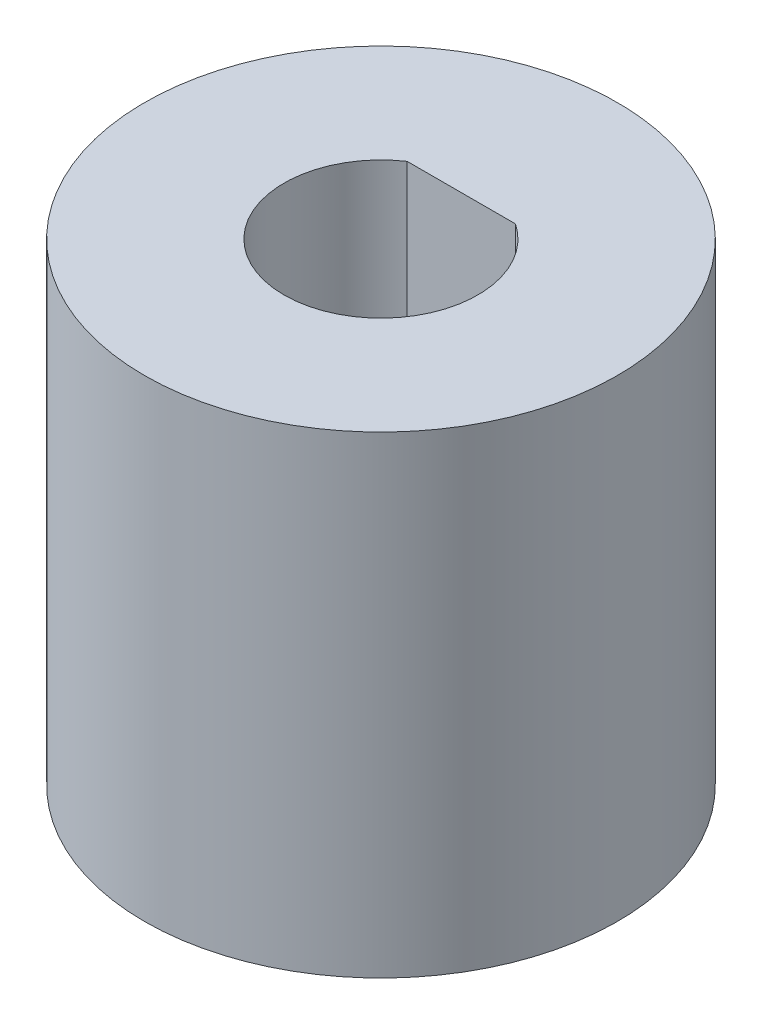
ISO-10303-21;
HEADER;
FILE_DESCRIPTION(('STEP AP214'),'2;1');
FILE_NAME('part.step','',(''),(''),'','','');
FILE_SCHEMA(('AUTOMOTIVE_DESIGN { 1 0 10303 214 1 1 1 1 }'));
ENDSEC;
DATA;
#1=APPLICATION_CONTEXT('core data for automotive mechanical design processes');
#2=APPLICATION_PROTOCOL_DEFINITION('international standard','automotive_design',2000,#1);
#3=PRODUCT_CONTEXT('',#1,'mechanical');
#4=PRODUCT('Part','Part','',(#3));
#5=PRODUCT_RELATED_PRODUCT_CATEGORY('part','',(#4));
#6=PRODUCT_DEFINITION_FORMATION('','',#4);
#7=PRODUCT_DEFINITION_CONTEXT('part definition',#1,'design');
#8=PRODUCT_DEFINITION('design','',#6,#7);
#9=PRODUCT_DEFINITION_SHAPE('','',#8);
#10=(LENGTH_UNIT() NAMED_UNIT(*) SI_UNIT(.MILLI.,.METRE.));
#11=(NAMED_UNIT(*) PLANE_ANGLE_UNIT() SI_UNIT($,.RADIAN.));
#12=(NAMED_UNIT(*) SI_UNIT($,.STERADIAN.) SOLID_ANGLE_UNIT());
#13=UNCERTAINTY_MEASURE_WITH_UNIT(LENGTH_MEASURE(1.E-05),#10,'distance_accuracy_value','');
#14=(GEOMETRIC_REPRESENTATION_CONTEXT(3) GLOBAL_UNCERTAINTY_ASSIGNED_CONTEXT((#13)) GLOBAL_UNIT_ASSIGNED_CONTEXT((#10,
#11,#12)) REPRESENTATION_CONTEXT('',''));
#15=CARTESIAN_POINT('',(0.,0.,0.));
#16=DIRECTION('',(0.,0.,1.));
#17=DIRECTION('',(1.,0.,0.));
#18=AXIS2_PLACEMENT_3D('',#15,#16,#17);
#19=CARTESIAN_POINT('',(0.,15.,0.));
#20=DIRECTION('',(0.,-1.,0.));
#21=DIRECTION('',(0.,0.,-1.));
#22=AXIS2_PLACEMENT_3D('',#19,#20,#21);
#23=CYLINDRICAL_SURFACE('',#22,7.5);
#24=CARTESIAN_POINT('',(0.,15.,0.));
#25=DIRECTION('',(0.,1.,0.));
#26=DIRECTION('',(0.,0.,1.));
#27=AXIS2_PLACEMENT_3D('',#24,#25,#26);
#28=CIRCLE('',#27,7.5);
#29=CARTESIAN_POINT('',(0.,15.,7.5));
#30=VERTEX_POINT('',#29);
#31=EDGE_CURVE('E11',#30,#30,#28,.T.);
#32=ORIENTED_EDGE('',*,*,#31,.F.);
#33=EDGE_LOOP('',(#32));
#34=FACE_BOUND('',#33,.T.);
#35=CARTESIAN_POINT('',(0.,0.,0.));
#36=DIRECTION('',(0.,1.,0.));
#37=DIRECTION('',(0.,0.,1.));
#38=AXIS2_PLACEMENT_3D('',#35,#36,#37);
#39=CIRCLE('',#38,7.5);
#40=CARTESIAN_POINT('',(0.,0.,7.5));
#41=VERTEX_POINT('',#40);
#42=EDGE_CURVE('E48',#41,#41,#39,.T.);
#43=ORIENTED_EDGE('',*,*,#42,.T.);
#44=EDGE_LOOP('',(#43));
#45=FACE_BOUND('',#44,.T.);
#46=ADVANCED_FACE('F45',(#34,#45),#23,.T.);
#47=CARTESIAN_POINT('',(0.,15.,0.));
#48=DIRECTION('',(0.,1.,0.));
#49=DIRECTION('',(0.,0.,1.));
#50=AXIS2_PLACEMENT_3D('',#47,#48,#49);
#51=PLANE('',#50);
#52=CARTESIAN_POINT('',(0.,15.,0.));
#53=DIRECTION('',(0.,1.,0.));
#54=DIRECTION('',(0.,0.,1.));
#55=AXIS2_PLACEMENT_3D('',#52,#53,#54);
#56=CIRCLE('',#55,3.075);
#57=CARTESIAN_POINT('',(-1.71846588560844,15.,-2.55));
#58=VERTEX_POINT('',#57);
#59=CARTESIAN_POINT('',(1.71846588560844,15.,-2.55));
#60=VERTEX_POINT('',#59);
#61=EDGE_CURVE('E60',#58,#60,#56,.T.);
#62=ORIENTED_EDGE('',*,*,#61,.F.);
#63=DIRECTION('',(-1.,0.,0.));
#64=VECTOR('',#63,1.);
#65=CARTESIAN_POINT('',(1.71846588560844,15.,-2.55));
#66=LINE('',#65,#64);
#67=EDGE_CURVE('E80',#60,#58,#66,.T.);
#68=ORIENTED_EDGE('',*,*,#67,.F.);
#69=EDGE_LOOP('',(#62,#68));
#70=FACE_BOUND('',#69,.T.);
#71=ORIENTED_EDGE('',*,*,#31,.T.);
#72=EDGE_LOOP('',(#71));
#73=FACE_BOUND('',#72,.T.);
#74=ADVANCED_FACE('F85',(#70,#73),#51,.T.);
#75=CARTESIAN_POINT('',(0.,0.,0.));
#76=DIRECTION('',(0.,1.,0.));
#77=DIRECTION('',(0.,0.,1.));
#78=AXIS2_PLACEMENT_3D('',#75,#76,#77);
#79=PLANE('',#78);
#80=ORIENTED_EDGE('',*,*,#42,.F.);
#81=EDGE_LOOP('',(#80));
#82=FACE_BOUND('',#81,.T.);
#83=ADVANCED_FACE('F110',(#82),#79,.F.);
#84=CARTESIAN_POINT('',(0.,5.,0.));
#85=DIRECTION('',(0.,1.,0.));
#86=DIRECTION('',(0.,0.,1.));
#87=AXIS2_PLACEMENT_3D('',#84,#85,#86);
#88=CYLINDRICAL_SURFACE('',#87,3.075);
#89=ORIENTED_EDGE('',*,*,#61,.T.);
#90=DIRECTION('',(0.,1.,0.));
#91=VECTOR('',#90,1.);
#92=CARTESIAN_POINT('',(1.71846588560844,5.,-2.55));
#93=LINE('',#92,#91);
#94=CARTESIAN_POINT('',(1.71846588560844,5.,-2.55));
#95=VERTEX_POINT('',#94);
#96=EDGE_CURVE('E77',#95,#60,#93,.T.);
#97=ORIENTED_EDGE('',*,*,#96,.F.);
#98=CARTESIAN_POINT('',(0.,5.,0.));
#99=DIRECTION('',(0.,1.,0.));
#100=DIRECTION('',(0.,0.,1.));
#101=AXIS2_PLACEMENT_3D('',#98,#99,#100);
#102=CIRCLE('',#101,3.075);
#103=CARTESIAN_POINT('',(-1.71846588560844,5.,-2.55));
#104=VERTEX_POINT('',#103);
#105=EDGE_CURVE('E74',#104,#95,#102,.T.);
#106=ORIENTED_EDGE('',*,*,#105,.F.);
#107=DIRECTION('',(0.,1.,0.));
#108=VECTOR('',#107,1.);
#109=CARTESIAN_POINT('',(-1.71846588560844,5.,-2.55));
#110=LINE('',#109,#108);
#111=EDGE_CURVE('E68',#104,#58,#110,.T.);
#112=ORIENTED_EDGE('',*,*,#111,.T.);
#113=EDGE_LOOP('',(#89,#97,#106,#112));
#114=FACE_BOUND('',#113,.T.);
#115=ADVANCED_FACE('F72',(#114),#88,.F.);
#116=CARTESIAN_POINT('',(1.71846588560844,5.,-2.55));
#117=DIRECTION('',(0.,0.,-1.));
#118=DIRECTION('',(-1.,0.,0.));
#119=AXIS2_PLACEMENT_3D('',#116,#117,#118);
#120=PLANE('',#119);
#121=ORIENTED_EDGE('',*,*,#67,.T.);
#122=ORIENTED_EDGE('',*,*,#111,.F.);
#123=DIRECTION('',(-1.,0.,0.));
#124=VECTOR('',#123,1.);
#125=CARTESIAN_POINT('',(1.71846588560844,5.,-2.55));
#126=LINE('',#125,#124);
#127=EDGE_CURVE('E90',#95,#104,#126,.T.);
#128=ORIENTED_EDGE('',*,*,#127,.F.);
#129=ORIENTED_EDGE('',*,*,#96,.T.);
#130=EDGE_LOOP('',(#121,#122,#128,#129));
#131=FACE_BOUND('',#130,.T.);
#132=ADVANCED_FACE('F81',(#131),#120,.F.);
#133=CARTESIAN_POINT('',(0.,5.,0.));
#134=DIRECTION('',(0.,1.,0.));
#135=DIRECTION('',(0.,0.,1.));
#136=AXIS2_PLACEMENT_3D('',#133,#134,#135);
#137=PLANE('',#136);
#138=ORIENTED_EDGE('',*,*,#105,.T.);
#139=ORIENTED_EDGE('',*,*,#127,.T.);
#140=EDGE_LOOP('',(#138,#139));
#141=FACE_BOUND('',#140,.T.);
#142=ADVANCED_FACE('F97',(#141),#137,.T.);
#143=CLOSED_SHELL('',(#46,#74,#83,#115,#132,#142));
#144=MANIFOLD_SOLID_BREP('B2',#143);
#145=ADVANCED_BREP_SHAPE_REPRESENTATION('',(#18,#144),#14);
#146=SHAPE_DEFINITION_REPRESENTATION(#9,#145);
ENDSEC;
END-ISO-10303-21;
